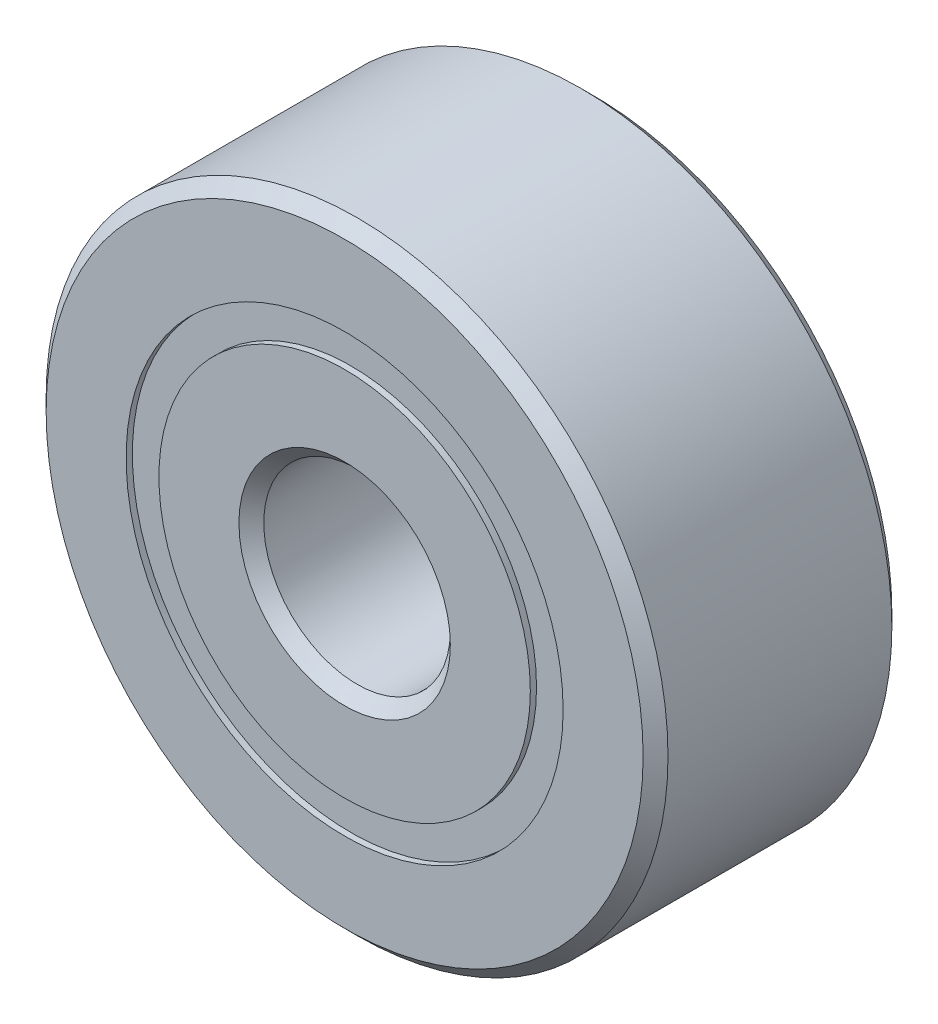
ISO-10303-21;
HEADER;
FILE_DESCRIPTION(('STEP AP214'),'2;1');
FILE_NAME('part.step','',(''),(''),'','','');
FILE_SCHEMA(('AUTOMOTIVE_DESIGN { 1 0 10303 214 1 1 1 1 }'));
ENDSEC;
DATA;
#1=APPLICATION_CONTEXT('core data for automotive mechanical design processes');
#2=APPLICATION_PROTOCOL_DEFINITION('international standard','automotive_design',2000,#1);
#3=PRODUCT_CONTEXT('',#1,'mechanical');
#4=PRODUCT('Part','Part','',(#3));
#5=PRODUCT_RELATED_PRODUCT_CATEGORY('part','',(#4));
#6=PRODUCT_DEFINITION_FORMATION('','',#4);
#7=PRODUCT_DEFINITION_CONTEXT('part definition',#1,'design');
#8=PRODUCT_DEFINITION('design','',#6,#7);
#9=PRODUCT_DEFINITION_SHAPE('','',#8);
#10=(LENGTH_UNIT() NAMED_UNIT(*) SI_UNIT(.MILLI.,.METRE.));
#11=(NAMED_UNIT(*) PLANE_ANGLE_UNIT() SI_UNIT($,.RADIAN.));
#12=(NAMED_UNIT(*) SI_UNIT($,.STERADIAN.) SOLID_ANGLE_UNIT());
#13=UNCERTAINTY_MEASURE_WITH_UNIT(LENGTH_MEASURE(1.E-05),#10,'distance_accuracy_value','');
#14=(GEOMETRIC_REPRESENTATION_CONTEXT(3) GLOBAL_UNCERTAINTY_ASSIGNED_CONTEXT((#13)) GLOBAL_UNIT_ASSIGNED_CONTEXT((#10,
#11,#12)) REPRESENTATION_CONTEXT('',''));
#15=CARTESIAN_POINT('',(0.,0.,0.));
#16=DIRECTION('',(0.,0.,1.));
#17=DIRECTION('',(1.,0.,0.));
#18=AXIS2_PLACEMENT_3D('',#15,#16,#17);
#19=CARTESIAN_POINT('',(0.,3.51373626373626,-1.9));
#20=DIRECTION('',(0.,0.,1.));
#21=DIRECTION('',(1.,0.,0.));
#22=AXIS2_PLACEMENT_3D('',#19,#20,#21);
#23=PLANE('',#22);
#24=CARTESIAN_POINT('',(0.,0.,-1.9));
#25=DIRECTION('',(0.,0.,1.));
#26=DIRECTION('',(1.,0.,0.));
#27=AXIS2_PLACEMENT_3D('',#24,#25,#26);
#28=CIRCLE('',#27,3.51373626373626);
#29=CARTESIAN_POINT('',(3.51373626373626,0.,-1.9));
#30=VERTEX_POINT('',#29);
#31=EDGE_CURVE('E75',#30,#30,#28,.T.);
#32=ORIENTED_EDGE('',*,*,#31,.F.);
#33=EDGE_LOOP('',(#32));
#34=FACE_BOUND('',#33,.T.);
#35=CARTESIAN_POINT('',(0.,0.,-1.9));
#36=DIRECTION('',(0.,0.,1.));
#37=DIRECTION('',(1.,0.,0.));
#38=AXIS2_PLACEMENT_3D('',#35,#36,#37);
#39=CIRCLE('',#38,2.98626373626374);
#40=CARTESIAN_POINT('',(2.98626373626374,0.,-1.9));
#41=VERTEX_POINT('',#40);
#42=EDGE_CURVE('E11',#41,#41,#39,.T.);
#43=ORIENTED_EDGE('',*,*,#42,.T.);
#44=EDGE_LOOP('',(#43));
#45=FACE_BOUND('',#44,.T.);
#46=ADVANCED_FACE('F56',(#34,#45),#23,.F.);
#47=CARTESIAN_POINT('',(0.,0.,2.));
#48=DIRECTION('',(0.,0.,1.));
#49=DIRECTION('',(1.,0.,0.));
#50=AXIS2_PLACEMENT_3D('',#47,#48,#49);
#51=CYLINDRICAL_SURFACE('',#50,2.98626373626374);
#52=ORIENTED_EDGE('',*,*,#42,.F.);
#53=EDGE_LOOP('',(#52));
#54=FACE_BOUND('',#53,.T.);
#55=CARTESIAN_POINT('',(0.,0.,-0.927189448602436));
#56=DIRECTION('',(0.,0.,1.));
#57=DIRECTION('',(1.,0.,0.));
#58=AXIS2_PLACEMENT_3D('',#55,#56,#57);
#59=CIRCLE('',#58,2.98626373626374);
#60=CARTESIAN_POINT('',(2.98626373626374,0.,-0.927189448602436));
#61=VERTEX_POINT('',#60);
#62=EDGE_CURVE('E63',#61,#61,#59,.T.);
#63=ORIENTED_EDGE('',*,*,#62,.T.);
#64=EDGE_LOOP('',(#63));
#65=FACE_BOUND('',#64,.T.);
#66=ADVANCED_FACE('F86',(#54,#65),#51,.F.);
#67=CARTESIAN_POINT('',(0.,3.51373626373626,-0.927189448602435));
#68=DIRECTION('',(0.,0.,-1.));
#69=DIRECTION('',(-1.,0.,0.));
#70=AXIS2_PLACEMENT_3D('',#67,#68,#69);
#71=PLANE('',#70);
#72=ORIENTED_EDGE('',*,*,#62,.F.);
#73=EDGE_LOOP('',(#72));
#74=FACE_BOUND('',#73,.T.);
#75=CARTESIAN_POINT('',(0.,0.,-0.927189448602436));
#76=DIRECTION('',(0.,0.,1.));
#77=DIRECTION('',(1.,0.,0.));
#78=AXIS2_PLACEMENT_3D('',#75,#76,#77);
#79=CIRCLE('',#78,3.51373626373626);
#80=CARTESIAN_POINT('',(3.51373626373626,0.,-0.927189448602436));
#81=VERTEX_POINT('',#80);
#82=EDGE_CURVE('E69',#81,#81,#79,.T.);
#83=ORIENTED_EDGE('',*,*,#82,.T.);
#84=EDGE_LOOP('',(#83));
#85=FACE_BOUND('',#84,.T.);
#86=ADVANCED_FACE('F90',(#74,#85),#71,.F.);
#87=CARTESIAN_POINT('',(0.,0.,2.));
#88=DIRECTION('',(0.,0.,1.));
#89=DIRECTION('',(1.,0.,0.));
#90=AXIS2_PLACEMENT_3D('',#87,#88,#89);
#91=CYLINDRICAL_SURFACE('',#90,3.51373626373626);
#92=ORIENTED_EDGE('',*,*,#82,.F.);
#93=EDGE_LOOP('',(#92));
#94=FACE_BOUND('',#93,.T.);
#95=ORIENTED_EDGE('',*,*,#31,.T.);
#96=EDGE_LOOP('',(#95));
#97=FACE_BOUND('',#96,.T.);
#98=ADVANCED_FACE('F83',(#94,#97),#91,.T.);
#99=CLOSED_SHELL('',(#46,#66,#86,#98));
#100=MANIFOLD_SOLID_BREP('B2',#99);
#101=CARTESIAN_POINT('',(0.,3.51373626373626,1.9));
#102=DIRECTION('',(0.,0.,-1.));
#103=DIRECTION('',(-1.,0.,0.));
#104=AXIS2_PLACEMENT_3D('',#101,#102,#103);
#105=PLANE('',#104);
#106=CARTESIAN_POINT('',(0.,0.,1.9));
#107=DIRECTION('',(0.,0.,1.));
#108=DIRECTION('',(1.,0.,0.));
#109=AXIS2_PLACEMENT_3D('',#106,#107,#108);
#110=CIRCLE('',#109,2.98626373626374);
#111=CARTESIAN_POINT('',(2.98626373626374,0.,1.9));
#112=VERTEX_POINT('',#111);
#113=EDGE_CURVE('E55',#112,#112,#110,.T.);
#114=ORIENTED_EDGE('',*,*,#113,.F.);
#115=EDGE_LOOP('',(#114));
#116=FACE_BOUND('',#115,.T.);
#117=CARTESIAN_POINT('',(0.,0.,1.9));
#118=DIRECTION('',(0.,0.,1.));
#119=DIRECTION('',(1.,0.,0.));
#120=AXIS2_PLACEMENT_3D('',#117,#118,#119);
#121=CIRCLE('',#120,3.51373626373626);
#122=CARTESIAN_POINT('',(3.51373626373626,0.,1.9));
#123=VERTEX_POINT('',#122);
#124=EDGE_CURVE('E151',#123,#123,#121,.T.);
#125=ORIENTED_EDGE('',*,*,#124,.T.);
#126=EDGE_LOOP('',(#125));
#127=FACE_BOUND('',#126,.T.);
#128=ADVANCED_FACE('F132',(#116,#127),#105,.F.);
#129=CARTESIAN_POINT('',(0.,0.,2.));
#130=DIRECTION('',(0.,0.,1.));
#131=DIRECTION('',(1.,0.,0.));
#132=AXIS2_PLACEMENT_3D('',#129,#130,#131);
#133=CYLINDRICAL_SURFACE('',#132,2.98626373626374);
#134=CARTESIAN_POINT('',(0.,0.,0.927189448602434));
#135=DIRECTION('',(0.,0.,1.));
#136=DIRECTION('',(1.,0.,0.));
#137=AXIS2_PLACEMENT_3D('',#134,#135,#136);
#138=CIRCLE('',#137,2.98626373626374);
#139=CARTESIAN_POINT('',(2.98626373626374,0.,0.927189448602434));
#140=VERTEX_POINT('',#139);
#141=EDGE_CURVE('E139',#140,#140,#138,.T.);
#142=ORIENTED_EDGE('',*,*,#141,.F.);
#143=EDGE_LOOP('',(#142));
#144=FACE_BOUND('',#143,.T.);
#145=ORIENTED_EDGE('',*,*,#113,.T.);
#146=EDGE_LOOP('',(#145));
#147=FACE_BOUND('',#146,.T.);
#148=ADVANCED_FACE('F168',(#144,#147),#133,.F.);
#149=CARTESIAN_POINT('',(0.,3.51373626373626,0.927189448602434));
#150=DIRECTION('',(0.,0.,1.));
#151=DIRECTION('',(1.,0.,0.));
#152=AXIS2_PLACEMENT_3D('',#149,#150,#151);
#153=PLANE('',#152);
#154=CARTESIAN_POINT('',(0.,0.,0.927189448602434));
#155=DIRECTION('',(0.,0.,1.));
#156=DIRECTION('',(1.,0.,0.));
#157=AXIS2_PLACEMENT_3D('',#154,#155,#156);
#158=CIRCLE('',#157,3.51373626373626);
#159=CARTESIAN_POINT('',(3.51373626373626,0.,0.927189448602434));
#160=VERTEX_POINT('',#159);
#161=EDGE_CURVE('E145',#160,#160,#158,.T.);
#162=ORIENTED_EDGE('',*,*,#161,.F.);
#163=EDGE_LOOP('',(#162));
#164=FACE_BOUND('',#163,.T.);
#165=ORIENTED_EDGE('',*,*,#141,.T.);
#166=EDGE_LOOP('',(#165));
#167=FACE_BOUND('',#166,.T.);
#168=ADVANCED_FACE('F163',(#164,#167),#153,.F.);
#169=CARTESIAN_POINT('',(0.,0.,2.));
#170=DIRECTION('',(0.,0.,1.));
#171=DIRECTION('',(1.,0.,0.));
#172=AXIS2_PLACEMENT_3D('',#169,#170,#171);
#173=CYLINDRICAL_SURFACE('',#172,3.51373626373626);
#174=ORIENTED_EDGE('',*,*,#124,.F.);
#175=EDGE_LOOP('',(#174));
#176=FACE_BOUND('',#175,.T.);
#177=ORIENTED_EDGE('',*,*,#161,.T.);
#178=EDGE_LOOP('',(#177));
#179=FACE_BOUND('',#178,.T.);
#180=ADVANCED_FACE('F160',(#176,#179),#173,.T.);
#181=CLOSED_SHELL('',(#128,#148,#168,#180));
#182=MANIFOLD_SOLID_BREP('B6',#181);
#183=CARTESIAN_POINT('',(-1.62499999999996,2.81458256229945,0.));
#184=DIRECTION('',(0.,0.,1.));
#185=DIRECTION('',(-0.499999999999989,0.866025403784445,0.));
#186=AXIS2_PLACEMENT_3D('',#183,#184,#185);
#187=SPHERICAL_SURFACE('',#186,0.927189448602435);
#188=CARTESIAN_POINT('',(-1.62499999999996,2.81458256229945,0.927189448602434));
#189=VERTEX_POINT('',#188);
#190=VERTEX_LOOP('',#189);
#191=FACE_BOUND('',#190,.T.);
#192=ADVANCED_FACE('F208',(#191),#187,.T.);
#193=CLOSED_SHELL('',(#192));
#194=MANIFOLD_SOLID_BREP('B50',#193);
#195=CARTESIAN_POINT('',(-2.81458256229941,1.62500000000003,0.));
#196=DIRECTION('',(0.,0.,1.));
#197=DIRECTION('',(-0.866025403784433,0.50000000000001,0.));
#198=AXIS2_PLACEMENT_3D('',#195,#196,#197);
#199=SPHERICAL_SURFACE('',#198,0.927189448602435);
#200=CARTESIAN_POINT('',(-2.81458256229941,1.62500000000003,0.927189448602434));
#201=VERTEX_POINT('',#200);
#202=VERTEX_LOOP('',#201);
#203=FACE_BOUND('',#202,.T.);
#204=ADVANCED_FACE('F229',(#203),#199,.T.);
#205=CLOSED_SHELL('',(#204));
#206=MANIFOLD_SOLID_BREP('B128',#205);
#207=CARTESIAN_POINT('',(-3.25,0.,0.));
#208=DIRECTION('',(0.,0.,1.));
#209=DIRECTION('',(-1.,0.,0.));
#210=AXIS2_PLACEMENT_3D('',#207,#208,#209);
#211=SPHERICAL_SURFACE('',#210,0.927189448602435);
#212=CARTESIAN_POINT('',(-3.25,0.,0.927189448602434));
#213=VERTEX_POINT('',#212);
#214=VERTEX_LOOP('',#213);
#215=FACE_BOUND('',#214,.T.);
#216=ADVANCED_FACE('F250',(#215),#211,.T.);
#217=CLOSED_SHELL('',(#216));
#218=MANIFOLD_SOLID_BREP('B204',#217);
#219=CARTESIAN_POINT('',(-2.81458256229944,-1.62499999999997,0.));
#220=DIRECTION('',(0.,0.,1.));
#221=DIRECTION('',(-0.866025403784443,-0.499999999999992,0.));
#222=AXIS2_PLACEMENT_3D('',#219,#220,#221);
#223=SPHERICAL_SURFACE('',#222,0.927189448602435);
#224=CARTESIAN_POINT('',(-2.81458256229944,-1.62499999999997,0.927189448602434));
#225=VERTEX_POINT('',#224);
#226=VERTEX_LOOP('',#225);
#227=FACE_BOUND('',#226,.T.);
#228=ADVANCED_FACE('F271',(#227),#223,.T.);
#229=CLOSED_SHELL('',(#228));
#230=MANIFOLD_SOLID_BREP('B225',#229);
#231=CARTESIAN_POINT('',(-1.62500000000002,-2.81458256229941,0.));
#232=DIRECTION('',(0.,0.,1.));
#233=DIRECTION('',(-0.500000000000007,-0.866025403784435,0.));
#234=AXIS2_PLACEMENT_3D('',#231,#232,#233);
#235=SPHERICAL_SURFACE('',#234,0.927189448602435);
#236=CARTESIAN_POINT('',(-1.62500000000002,-2.81458256229941,0.927189448602434));
#237=VERTEX_POINT('',#236);
#238=VERTEX_LOOP('',#237);
#239=FACE_BOUND('',#238,.T.);
#240=ADVANCED_FACE('F292',(#239),#235,.T.);
#241=CLOSED_SHELL('',(#240));
#242=MANIFOLD_SOLID_BREP('B246',#241);
#243=CARTESIAN_POINT('',(0.,-3.25,0.));
#244=DIRECTION('',(0.,0.,1.));
#245=DIRECTION('',(0.,-1.,0.));
#246=AXIS2_PLACEMENT_3D('',#243,#244,#245);
#247=SPHERICAL_SURFACE('',#246,0.927189448602435);
#248=CARTESIAN_POINT('',(0.,-3.25,0.927189448602434));
#249=VERTEX_POINT('',#248);
#250=VERTEX_LOOP('',#249);
#251=FACE_BOUND('',#250,.T.);
#252=ADVANCED_FACE('F313',(#251),#247,.T.);
#253=CLOSED_SHELL('',(#252));
#254=MANIFOLD_SOLID_BREP('B267',#253);
#255=CARTESIAN_POINT('',(1.62499999999998,-2.81458256229944,0.));
#256=DIRECTION('',(0.,0.,1.));
#257=DIRECTION('',(0.499999999999995,-0.866025403784442,0.));
#258=AXIS2_PLACEMENT_3D('',#255,#256,#257);
#259=SPHERICAL_SURFACE('',#258,0.927189448602435);
#260=CARTESIAN_POINT('',(1.62499999999998,-2.81458256229944,0.927189448602434));
#261=VERTEX_POINT('',#260);
#262=VERTEX_LOOP('',#261);
#263=FACE_BOUND('',#262,.T.);
#264=ADVANCED_FACE('F334',(#263),#259,.T.);
#265=CLOSED_SHELL('',(#264));
#266=MANIFOLD_SOLID_BREP('B288',#265);
#267=CARTESIAN_POINT('',(2.81458256229942,-1.62500000000001,0.));
#268=DIRECTION('',(0.,0.,1.));
#269=DIRECTION('',(0.866025403784436,-0.500000000000004,0.));
#270=AXIS2_PLACEMENT_3D('',#267,#268,#269);
#271=SPHERICAL_SURFACE('',#270,0.927189448602435);
#272=CARTESIAN_POINT('',(2.81458256229942,-1.62500000000001,0.927189448602434));
#273=VERTEX_POINT('',#272);
#274=VERTEX_LOOP('',#273);
#275=FACE_BOUND('',#274,.T.);
#276=ADVANCED_FACE('F355',(#275),#271,.T.);
#277=CLOSED_SHELL('',(#276));
#278=MANIFOLD_SOLID_BREP('B309',#277);
#279=CARTESIAN_POINT('',(3.25,0.,0.));
#280=DIRECTION('',(0.,0.,1.));
#281=DIRECTION('',(1.,0.,0.));
#282=AXIS2_PLACEMENT_3D('',#279,#280,#281);
#283=SPHERICAL_SURFACE('',#282,0.927189448602435);
#284=CARTESIAN_POINT('',(3.25,0.,0.927189448602434));
#285=VERTEX_POINT('',#284);
#286=VERTEX_LOOP('',#285);
#287=FACE_BOUND('',#286,.T.);
#288=ADVANCED_FACE('F376',(#287),#283,.T.);
#289=CLOSED_SHELL('',(#288));
#290=MANIFOLD_SOLID_BREP('B330',#289);
#291=CARTESIAN_POINT('',(2.81458256229943,1.62499999999999,0.));
#292=DIRECTION('',(0.,0.,1.));
#293=DIRECTION('',(0.86602540378444,0.499999999999998,0.));
#294=AXIS2_PLACEMENT_3D('',#291,#292,#293);
#295=SPHERICAL_SURFACE('',#294,0.927189448602435);
#296=CARTESIAN_POINT('',(2.81458256229943,1.62499999999999,0.927189448602434));
#297=VERTEX_POINT('',#296);
#298=VERTEX_LOOP('',#297);
#299=FACE_BOUND('',#298,.T.);
#300=ADVANCED_FACE('F397',(#299),#295,.T.);
#301=CLOSED_SHELL('',(#300));
#302=MANIFOLD_SOLID_BREP('B351',#301);
#303=CARTESIAN_POINT('',(1.625,2.81458256229942,0.));
#304=DIRECTION('',(0.,0.,1.));
#305=DIRECTION('',(0.500000000000001,0.866025403784438,0.));
#306=AXIS2_PLACEMENT_3D('',#303,#304,#305);
#307=SPHERICAL_SURFACE('',#306,0.927189448602435);
#308=CARTESIAN_POINT('',(1.625,2.81458256229942,0.927189448602434));
#309=VERTEX_POINT('',#308);
#310=VERTEX_LOOP('',#309);
#311=FACE_BOUND('',#310,.T.);
#312=ADVANCED_FACE('F418',(#311),#307,.T.);
#313=CLOSED_SHELL('',(#312));
#314=MANIFOLD_SOLID_BREP('B372',#313);
#315=CARTESIAN_POINT('',(0.,3.25,0.));
#316=DIRECTION('',(0.,0.,1.));
#317=DIRECTION('',(0.,1.,0.));
#318=AXIS2_PLACEMENT_3D('',#315,#316,#317);
#319=SPHERICAL_SURFACE('',#318,0.927189448602435);
#320=CARTESIAN_POINT('',(0.,3.25,0.927189448602434));
#321=VERTEX_POINT('',#320);
#322=VERTEX_LOOP('',#321);
#323=FACE_BOUND('',#322,.T.);
#324=ADVANCED_FACE('F441',(#323),#319,.T.);
#325=CLOSED_SHELL('',(#324));
#326=MANIFOLD_SOLID_BREP('B393',#325);
#327=CARTESIAN_POINT('',(0.,2.98626373626374,2.));
#328=DIRECTION('',(0.,0.,-1.));
#329=DIRECTION('',(-1.,0.,0.));
#330=AXIS2_PLACEMENT_3D('',#327,#328,#329);
#331=PLANE('',#330);
#332=CARTESIAN_POINT('',(0.,0.,2.));
#333=DIRECTION('',(0.,0.,1.));
#334=DIRECTION('',(1.,0.,0.));
#335=AXIS2_PLACEMENT_3D('',#332,#333,#334);
#336=CIRCLE('',#335,1.7);
#337=CARTESIAN_POINT('',(1.7,0.,2.));
#338=VERTEX_POINT('',#337);
#339=EDGE_CURVE('E498',#338,#338,#336,.T.);
#340=ORIENTED_EDGE('',*,*,#339,.F.);
#341=EDGE_LOOP('',(#340));
#342=FACE_BOUND('',#341,.T.);
#343=CARTESIAN_POINT('',(0.,0.,2.));
#344=DIRECTION('',(0.,0.,1.));
#345=DIRECTION('',(1.,0.,0.));
#346=AXIS2_PLACEMENT_3D('',#343,#344,#345);
#347=CIRCLE('',#346,2.98626373626374);
#348=CARTESIAN_POINT('',(2.98626373626374,0.,2.));
#349=VERTEX_POINT('',#348);
#350=EDGE_CURVE('E440',#349,#349,#347,.T.);
#351=ORIENTED_EDGE('',*,*,#350,.T.);
#352=EDGE_LOOP('',(#351));
#353=FACE_BOUND('',#352,.T.);
#354=ADVANCED_FACE('F461',(#342,#353),#331,.F.);
#355=CARTESIAN_POINT('',(0.,0.,2.));
#356=DIRECTION('',(0.,0.,1.));
#357=DIRECTION('',(1.,0.,0.));
#358=AXIS2_PLACEMENT_3D('',#355,#356,#357);
#359=CYLINDRICAL_SURFACE('',#358,2.98626373626374);
#360=ORIENTED_EDGE('',*,*,#350,.F.);
#361=EDGE_LOOP('',(#360));
#362=FACE_BOUND('',#361,.T.);
#363=CARTESIAN_POINT('',(0.,0.,0.888888888888888));
#364=DIRECTION('',(0.,0.,1.));
#365=DIRECTION('',(1.,0.,0.));
#366=AXIS2_PLACEMENT_3D('',#363,#364,#365);
#367=CIRCLE('',#366,2.98626373626374);
#368=CARTESIAN_POINT('',(2.98626373626374,0.,0.888888888888888));
#369=VERTEX_POINT('',#368);
#370=EDGE_CURVE('E468',#369,#369,#367,.T.);
#371=ORIENTED_EDGE('',*,*,#370,.T.);
#372=EDGE_LOOP('',(#371));
#373=FACE_BOUND('',#372,.T.);
#374=ADVANCED_FACE('F507',(#362,#373),#359,.T.);
#375=CARTESIAN_POINT('',(0.,0.,0.));
#376=DIRECTION('',(0.,0.,1.));
#377=DIRECTION('',(1.,0.,0.));
#378=AXIS2_PLACEMENT_3D('',#375,#376,#377);
#379=TOROIDAL_SURFACE('',#378,3.25,0.927189448602433);
#380=ORIENTED_EDGE('',*,*,#370,.F.);
#381=EDGE_LOOP('',(#380));
#382=FACE_BOUND('',#381,.T.);
#383=CARTESIAN_POINT('',(0.,0.,-0.88888888888889));
#384=DIRECTION('',(0.,0.,1.));
#385=DIRECTION('',(1.,0.,0.));
#386=AXIS2_PLACEMENT_3D('',#383,#384,#385);
#387=CIRCLE('',#386,2.98626373626374);
#388=CARTESIAN_POINT('',(2.98626373626374,0.,-0.88888888888889));
#389=VERTEX_POINT('',#388);
#390=EDGE_CURVE('E474',#389,#389,#387,.T.);
#391=ORIENTED_EDGE('',*,*,#390,.T.);
#392=EDGE_LOOP('',(#391));
#393=FACE_BOUND('',#392,.T.);
#394=ADVANCED_FACE('F511',(#382,#393),#379,.F.);
#395=CARTESIAN_POINT('',(0.,0.,2.));
#396=DIRECTION('',(0.,0.,1.));
#397=DIRECTION('',(1.,0.,0.));
#398=AXIS2_PLACEMENT_3D('',#395,#396,#397);
#399=CYLINDRICAL_SURFACE('',#398,2.98626373626374);
#400=ORIENTED_EDGE('',*,*,#390,.F.);
#401=EDGE_LOOP('',(#400));
#402=FACE_BOUND('',#401,.T.);
#403=CARTESIAN_POINT('',(0.,0.,-2.));
#404=DIRECTION('',(0.,0.,1.));
#405=DIRECTION('',(1.,0.,0.));
#406=AXIS2_PLACEMENT_3D('',#403,#404,#405);
#407=CIRCLE('',#406,2.98626373626374);
#408=CARTESIAN_POINT('',(2.98626373626374,0.,-2.));
#409=VERTEX_POINT('',#408);
#410=EDGE_CURVE('E480',#409,#409,#407,.T.);
#411=ORIENTED_EDGE('',*,*,#410,.T.);
#412=EDGE_LOOP('',(#411));
#413=FACE_BOUND('',#412,.T.);
#414=ADVANCED_FACE('F516',(#402,#413),#399,.T.);
#415=CARTESIAN_POINT('',(0.,1.7,-2.));
#416=DIRECTION('',(0.,0.,1.));
#417=DIRECTION('',(1.,0.,0.));
#418=AXIS2_PLACEMENT_3D('',#415,#416,#417);
#419=PLANE('',#418);
#420=ORIENTED_EDGE('',*,*,#410,.F.);
#421=EDGE_LOOP('',(#420));
#422=FACE_BOUND('',#421,.T.);
#423=CARTESIAN_POINT('',(0.,0.,-2.));
#424=DIRECTION('',(0.,0.,1.));
#425=DIRECTION('',(1.,0.,0.));
#426=AXIS2_PLACEMENT_3D('',#423,#424,#425);
#427=CIRCLE('',#426,1.7);
#428=CARTESIAN_POINT('',(1.7,0.,-2.));
#429=VERTEX_POINT('',#428);
#430=EDGE_CURVE('E486',#429,#429,#427,.T.);
#431=ORIENTED_EDGE('',*,*,#430,.T.);
#432=EDGE_LOOP('',(#431));
#433=FACE_BOUND('',#432,.T.);
#434=ADVANCED_FACE('F522',(#422,#433),#419,.F.);
#435=CARTESIAN_POINT('',(0.,0.,-1.8));
#436=DIRECTION('',(0.,0.,-1.));
#437=DIRECTION('',(-1.,0.,0.));
#438=AXIS2_PLACEMENT_3D('',#435,#436,#437);
#439=CONICAL_SURFACE('',#438,1.5,0.785398163397443);
#440=ORIENTED_EDGE('',*,*,#430,.F.);
#441=EDGE_LOOP('',(#440));
#442=FACE_BOUND('',#441,.T.);
#443=CARTESIAN_POINT('',(0.,0.,-1.8));
#444=DIRECTION('',(0.,0.,1.));
#445=DIRECTION('',(1.,0.,0.));
#446=AXIS2_PLACEMENT_3D('',#443,#444,#445);
#447=CIRCLE('',#446,1.5);
#448=CARTESIAN_POINT('',(1.5,0.,-1.8));
#449=VERTEX_POINT('',#448);
#450=EDGE_CURVE('E490',#449,#449,#447,.T.);
#451=ORIENTED_EDGE('',*,*,#450,.T.);
#452=EDGE_LOOP('',(#451));
#453=FACE_BOUND('',#452,.T.);
#454=ADVANCED_FACE('F526',(#442,#453),#439,.F.);
#455=CARTESIAN_POINT('',(0.,0.,2.));
#456=DIRECTION('',(0.,0.,1.));
#457=DIRECTION('',(1.,0.,0.));
#458=AXIS2_PLACEMENT_3D('',#455,#456,#457);
#459=CYLINDRICAL_SURFACE('',#458,1.5);
#460=ORIENTED_EDGE('',*,*,#450,.F.);
#461=EDGE_LOOP('',(#460));
#462=FACE_BOUND('',#461,.T.);
#463=CARTESIAN_POINT('',(0.,0.,1.8));
#464=DIRECTION('',(0.,0.,1.));
#465=DIRECTION('',(1.,0.,0.));
#466=AXIS2_PLACEMENT_3D('',#463,#464,#465);
#467=CIRCLE('',#466,1.5);
#468=CARTESIAN_POINT('',(1.5,0.,1.8));
#469=VERTEX_POINT('',#468);
#470=EDGE_CURVE('E494',#469,#469,#467,.T.);
#471=ORIENTED_EDGE('',*,*,#470,.T.);
#472=EDGE_LOOP('',(#471));
#473=FACE_BOUND('',#472,.T.);
#474=ADVANCED_FACE('F530',(#462,#473),#459,.F.);
#475=CARTESIAN_POINT('',(0.,0.,2.));
#476=DIRECTION('',(0.,0.,1.));
#477=DIRECTION('',(1.,0.,0.));
#478=AXIS2_PLACEMENT_3D('',#475,#476,#477);
#479=CONICAL_SURFACE('',#478,1.7,0.785398163397454);
#480=ORIENTED_EDGE('',*,*,#470,.F.);
#481=EDGE_LOOP('',(#480));
#482=FACE_BOUND('',#481,.T.);
#483=ORIENTED_EDGE('',*,*,#339,.T.);
#484=EDGE_LOOP('',(#483));
#485=FACE_BOUND('',#484,.T.);
#486=ADVANCED_FACE('F504',(#482,#485),#479,.F.);
#487=CLOSED_SHELL('',(#354,#374,#394,#414,#434,#454,#474,#486));
#488=MANIFOLD_SOLID_BREP('B414',#487);
#489=CARTESIAN_POINT('',(0.,0.,1.8));
#490=DIRECTION('',(0.,0.,-1.));
#491=DIRECTION('',(-1.,0.,0.));
#492=AXIS2_PLACEMENT_3D('',#489,#490,#491);
#493=CONICAL_SURFACE('',#492,5.,0.785398163397445);
#494=CARTESIAN_POINT('',(0.,0.,2.));
#495=DIRECTION('',(0.,0.,1.));
#496=DIRECTION('',(1.,0.,0.));
#497=AXIS2_PLACEMENT_3D('',#494,#495,#496);
#498=CIRCLE('',#497,4.8);
#499=CARTESIAN_POINT('',(4.8,0.,2.));
#500=VERTEX_POINT('',#499);
#501=EDGE_CURVE('E636',#500,#500,#498,.T.);
#502=ORIENTED_EDGE('',*,*,#501,.F.);
#503=EDGE_LOOP('',(#502));
#504=FACE_BOUND('',#503,.T.);
#505=CARTESIAN_POINT('',(0.,0.,1.8));
#506=DIRECTION('',(0.,0.,1.));
#507=DIRECTION('',(1.,0.,0.));
#508=AXIS2_PLACEMENT_3D('',#505,#506,#507);
#509=CIRCLE('',#508,5.);
#510=CARTESIAN_POINT('',(5.,0.,1.8));
#511=VERTEX_POINT('',#510);
#512=EDGE_CURVE('E460',#511,#511,#509,.T.);
#513=ORIENTED_EDGE('',*,*,#512,.T.);
#514=EDGE_LOOP('',(#513));
#515=FACE_BOUND('',#514,.T.);
#516=ADVANCED_FACE('F599',(#504,#515),#493,.T.);
#517=CARTESIAN_POINT('',(0.,0.,2.));
#518=DIRECTION('',(0.,0.,1.));
#519=DIRECTION('',(1.,0.,0.));
#520=AXIS2_PLACEMENT_3D('',#517,#518,#519);
#521=CYLINDRICAL_SURFACE('',#520,5.);
#522=ORIENTED_EDGE('',*,*,#512,.F.);
#523=EDGE_LOOP('',(#522));
#524=FACE_BOUND('',#523,.T.);
#525=CARTESIAN_POINT('',(0.,0.,-1.8));
#526=DIRECTION('',(0.,0.,1.));
#527=DIRECTION('',(1.,0.,0.));
#528=AXIS2_PLACEMENT_3D('',#525,#526,#527);
#529=CIRCLE('',#528,5.);
#530=CARTESIAN_POINT('',(5.,0.,-1.8));
#531=VERTEX_POINT('',#530);
#532=EDGE_CURVE('E606',#531,#531,#529,.T.);
#533=ORIENTED_EDGE('',*,*,#532,.T.);
#534=EDGE_LOOP('',(#533));
#535=FACE_BOUND('',#534,.T.);
#536=ADVANCED_FACE('F645',(#524,#535),#521,.T.);
#537=CARTESIAN_POINT('',(0.,0.,-2.));
#538=DIRECTION('',(0.,0.,1.));
#539=DIRECTION('',(1.,0.,0.));
#540=AXIS2_PLACEMENT_3D('',#537,#538,#539);
#541=CONICAL_SURFACE('',#540,4.8,0.785398163397444);
#542=ORIENTED_EDGE('',*,*,#532,.F.);
#543=EDGE_LOOP('',(#542));
#544=FACE_BOUND('',#543,.T.);
#545=CARTESIAN_POINT('',(0.,0.,-2.));
#546=DIRECTION('',(0.,0.,1.));
#547=DIRECTION('',(1.,0.,0.));
#548=AXIS2_PLACEMENT_3D('',#545,#546,#547);
#549=CIRCLE('',#548,4.8);
#550=CARTESIAN_POINT('',(4.8,0.,-2.));
#551=VERTEX_POINT('',#550);
#552=EDGE_CURVE('E612',#551,#551,#549,.T.);
#553=ORIENTED_EDGE('',*,*,#552,.T.);
#554=EDGE_LOOP('',(#553));
#555=FACE_BOUND('',#554,.T.);
#556=ADVANCED_FACE('F649',(#544,#555),#541,.T.);
#557=CARTESIAN_POINT('',(0.,4.8,-2.));
#558=DIRECTION('',(0.,0.,1.));
#559=DIRECTION('',(1.,0.,0.));
#560=AXIS2_PLACEMENT_3D('',#557,#558,#559);
#561=PLANE('',#560);
#562=ORIENTED_EDGE('',*,*,#552,.F.);
#563=EDGE_LOOP('',(#562));
#564=FACE_BOUND('',#563,.T.);
#565=CARTESIAN_POINT('',(0.,0.,-2.));
#566=DIRECTION('',(0.,0.,1.));
#567=DIRECTION('',(1.,0.,0.));
#568=AXIS2_PLACEMENT_3D('',#565,#566,#567);
#569=CIRCLE('',#568,3.51373626373626);
#570=CARTESIAN_POINT('',(3.51373626373626,0.,-2.));
#571=VERTEX_POINT('',#570);
#572=EDGE_CURVE('E618',#571,#571,#569,.T.);
#573=ORIENTED_EDGE('',*,*,#572,.T.);
#574=EDGE_LOOP('',(#573));
#575=FACE_BOUND('',#574,.T.);
#576=ADVANCED_FACE('F654',(#564,#575),#561,.F.);
#577=CARTESIAN_POINT('',(0.,0.,2.));
#578=DIRECTION('',(0.,0.,1.));
#579=DIRECTION('',(1.,0.,0.));
#580=AXIS2_PLACEMENT_3D('',#577,#578,#579);
#581=CYLINDRICAL_SURFACE('',#580,3.51373626373626);
#582=ORIENTED_EDGE('',*,*,#572,.F.);
#583=EDGE_LOOP('',(#582));
#584=FACE_BOUND('',#583,.T.);
#585=CARTESIAN_POINT('',(0.,0.,-0.88888888888889));
#586=DIRECTION('',(0.,0.,1.));
#587=DIRECTION('',(1.,0.,0.));
#588=AXIS2_PLACEMENT_3D('',#585,#586,#587);
#589=CIRCLE('',#588,3.51373626373626);
#590=CARTESIAN_POINT('',(3.51373626373626,0.,-0.88888888888889));
#591=VERTEX_POINT('',#590);
#592=EDGE_CURVE('E624',#591,#591,#589,.T.);
#593=ORIENTED_EDGE('',*,*,#592,.T.);
#594=EDGE_LOOP('',(#593));
#595=FACE_BOUND('',#594,.T.);
#596=ADVANCED_FACE('F660',(#584,#595),#581,.F.);
#597=CARTESIAN_POINT('',(0.,0.,0.));
#598=DIRECTION('',(0.,0.,1.));
#599=DIRECTION('',(1.,0.,0.));
#600=AXIS2_PLACEMENT_3D('',#597,#598,#599);
#601=TOROIDAL_SURFACE('',#600,3.25,0.927189448602435);
#602=ORIENTED_EDGE('',*,*,#592,.F.);
#603=EDGE_LOOP('',(#602));
#604=FACE_BOUND('',#603,.T.);
#605=CARTESIAN_POINT('',(0.,0.,0.888888888888888));
#606=DIRECTION('',(0.,0.,1.));
#607=DIRECTION('',(1.,0.,0.));
#608=AXIS2_PLACEMENT_3D('',#605,#606,#607);
#609=CIRCLE('',#608,3.51373626373626);
#610=CARTESIAN_POINT('',(3.51373626373626,0.,0.888888888888888));
#611=VERTEX_POINT('',#610);
#612=EDGE_CURVE('E628',#611,#611,#609,.T.);
#613=ORIENTED_EDGE('',*,*,#612,.T.);
#614=EDGE_LOOP('',(#613));
#615=FACE_BOUND('',#614,.T.);
#616=ADVANCED_FACE('F664',(#604,#615),#601,.F.);
#617=CARTESIAN_POINT('',(0.,0.,2.));
#618=DIRECTION('',(0.,0.,1.));
#619=DIRECTION('',(1.,0.,0.));
#620=AXIS2_PLACEMENT_3D('',#617,#618,#619);
#621=CYLINDRICAL_SURFACE('',#620,3.51373626373626);
#622=ORIENTED_EDGE('',*,*,#612,.F.);
#623=EDGE_LOOP('',(#622));
#624=FACE_BOUND('',#623,.T.);
#625=CARTESIAN_POINT('',(0.,0.,2.));
#626=DIRECTION('',(0.,0.,1.));
#627=DIRECTION('',(1.,0.,0.));
#628=AXIS2_PLACEMENT_3D('',#625,#626,#627);
#629=CIRCLE('',#628,3.51373626373626);
#630=CARTESIAN_POINT('',(3.51373626373626,0.,2.));
#631=VERTEX_POINT('',#630);
#632=EDGE_CURVE('E632',#631,#631,#629,.T.);
#633=ORIENTED_EDGE('',*,*,#632,.T.);
#634=EDGE_LOOP('',(#633));
#635=FACE_BOUND('',#634,.T.);
#636=ADVANCED_FACE('F668',(#624,#635),#621,.F.);
#637=CARTESIAN_POINT('',(0.,4.8,2.));
#638=DIRECTION('',(0.,0.,-1.));
#639=DIRECTION('',(-1.,0.,0.));
#640=AXIS2_PLACEMENT_3D('',#637,#638,#639);
#641=PLANE('',#640);
#642=ORIENTED_EDGE('',*,*,#632,.F.);
#643=EDGE_LOOP('',(#642));
#644=FACE_BOUND('',#643,.T.);
#645=ORIENTED_EDGE('',*,*,#501,.T.);
#646=EDGE_LOOP('',(#645));
#647=FACE_BOUND('',#646,.T.);
#648=ADVANCED_FACE('F642',(#644,#647),#641,.F.);
#649=CLOSED_SHELL('',(#516,#536,#556,#576,#596,#616,#636,#648));
#650=MANIFOLD_SOLID_BREP('B435',#649);
#651=ADVANCED_BREP_SHAPE_REPRESENTATION('',(#18,#100,#182,#194,#206,#218,#230,#242,#254,#266,
#278,#290,#302,#314,#326,#488,#650),#14);
#652=SHAPE_DEFINITION_REPRESENTATION(#9,#651);
ENDSEC;
END-ISO-10303-21;
